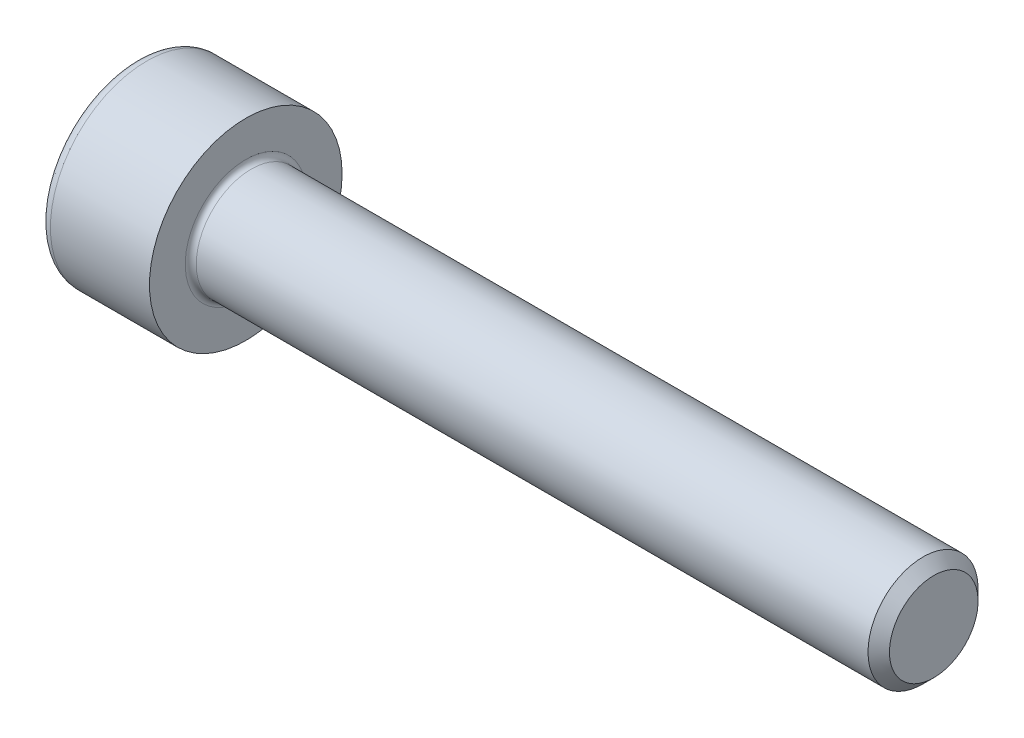
ISO-10303-21;
HEADER;
FILE_DESCRIPTION(('STEP AP214'),'2;1');
FILE_NAME('part.step','',(''),(''),'','','');
FILE_SCHEMA(('AUTOMOTIVE_DESIGN { 1 0 10303 214 1 1 1 1 }'));
ENDSEC;
DATA;
#1=APPLICATION_CONTEXT('core data for automotive mechanical design processes');
#2=APPLICATION_PROTOCOL_DEFINITION('international standard','automotive_design',2000,#1);
#3=PRODUCT_CONTEXT('',#1,'mechanical');
#4=PRODUCT('Part','Part','',(#3));
#5=PRODUCT_RELATED_PRODUCT_CATEGORY('part','',(#4));
#6=PRODUCT_DEFINITION_FORMATION('','',#4);
#7=PRODUCT_DEFINITION_CONTEXT('part definition',#1,'design');
#8=PRODUCT_DEFINITION('design','',#6,#7);
#9=PRODUCT_DEFINITION_SHAPE('','',#8);
#10=(LENGTH_UNIT() NAMED_UNIT(*) SI_UNIT(.MILLI.,.METRE.));
#11=(NAMED_UNIT(*) PLANE_ANGLE_UNIT() SI_UNIT($,.RADIAN.));
#12=(NAMED_UNIT(*) SI_UNIT($,.STERADIAN.) SOLID_ANGLE_UNIT());
#13=UNCERTAINTY_MEASURE_WITH_UNIT(LENGTH_MEASURE(1.E-05),#10,'distance_accuracy_value','');
#14=(GEOMETRIC_REPRESENTATION_CONTEXT(3) GLOBAL_UNCERTAINTY_ASSIGNED_CONTEXT((#13)) GLOBAL_UNIT_ASSIGNED_CONTEXT((#10,
#11,#12)) REPRESENTATION_CONTEXT('',''));
#15=CARTESIAN_POINT('',(0.,0.,0.));
#16=DIRECTION('',(0.,0.,1.));
#17=DIRECTION('',(1.,0.,0.));
#18=AXIS2_PLACEMENT_3D('',#15,#16,#17);
#19=CARTESIAN_POINT('',(2.,0.86602540378444,-1.5));
#20=DIRECTION('',(-1.,0.,0.));
#21=DIRECTION('',(0.,0.,1.));
#22=AXIS2_PLACEMENT_3D('',#19,#20,#21);
#23=PLANE('',#22);
#24=DIRECTION('',(0.,-1.,0.));
#25=VECTOR('',#24,1.);
#26=CARTESIAN_POINT('',(2.,0.86602540378444,1.5));
#27=LINE('',#26,#25);
#28=CARTESIAN_POINT('',(2.,0.,1.5));
#29=VERTEX_POINT('',#28);
#30=CARTESIAN_POINT('',(2.,-0.866025403784438,1.5));
#31=VERTEX_POINT('',#30);
#32=EDGE_CURVE('E167',#29,#31,#27,.T.);
#33=ORIENTED_EDGE('',*,*,#32,.F.);
#34=CARTESIAN_POINT('',(2.,0.,0.));
#35=DIRECTION('',(-1.,0.,0.));
#36=DIRECTION('',(0.,0.,1.));
#37=AXIS2_PLACEMENT_3D('',#34,#35,#36);
#38=CIRCLE('',#37,1.5);
#39=CARTESIAN_POINT('',(2.,-1.29903810567666,0.75));
#40=VERTEX_POINT('',#39);
#41=EDGE_CURVE('E50',#29,#40,#38,.F.);
#42=ORIENTED_EDGE('',*,*,#41,.T.);
#43=DIRECTION('',(0.,-0.5,-0.866025403784438));
#44=VECTOR('',#43,1.);
#45=CARTESIAN_POINT('',(2.,-0.866025403784438,1.5));
#46=LINE('',#45,#44);
#47=EDGE_CURVE('E173',#31,#40,#46,.T.);
#48=ORIENTED_EDGE('',*,*,#47,.F.);
#49=EDGE_LOOP('',(#33,#42,#48));
#50=FACE_BOUND('',#49,.T.);
#51=ADVANCED_FACE('F35',(#50),#23,.T.);
#52=CARTESIAN_POINT('',(2.,-1.73205080756888,0.));
#53=VERTEX_POINT('',#52);
#54=EDGE_CURVE('E172',#40,#53,#46,.T.);
#55=ORIENTED_EDGE('',*,*,#54,.F.);
#56=CARTESIAN_POINT('',(2.,-1.29903810567666,-0.75));
#57=VERTEX_POINT('',#56);
#58=EDGE_CURVE('E251',#40,#57,#38,.F.);
#59=ORIENTED_EDGE('',*,*,#58,.T.);
#60=DIRECTION('',(0.,0.5,-0.866025403784439));
#61=VECTOR('',#60,1.);
#62=CARTESIAN_POINT('',(2.,-1.73205080756888,0.));
#63=LINE('',#62,#61);
#64=EDGE_CURVE('E177',#53,#57,#63,.T.);
#65=ORIENTED_EDGE('',*,*,#64,.F.);
#66=EDGE_LOOP('',(#55,#59,#65));
#67=FACE_BOUND('',#66,.T.);
#68=ADVANCED_FACE('F122',(#67),#23,.T.);
#69=CARTESIAN_POINT('',(2.,-0.866025403784439,-1.5));
#70=VERTEX_POINT('',#69);
#71=EDGE_CURVE('E176',#57,#70,#63,.T.);
#72=ORIENTED_EDGE('',*,*,#71,.F.);
#73=CARTESIAN_POINT('',(2.,0.,-1.5));
#74=VERTEX_POINT('',#73);
#75=EDGE_CURVE('E247',#57,#74,#38,.F.);
#76=ORIENTED_EDGE('',*,*,#75,.T.);
#77=DIRECTION('',(0.,1.,0.));
#78=VECTOR('',#77,1.);
#79=CARTESIAN_POINT('',(2.,-0.866025403784439,-1.5));
#80=LINE('',#79,#78);
#81=EDGE_CURVE('E181',#70,#74,#80,.T.);
#82=ORIENTED_EDGE('',*,*,#81,.F.);
#83=EDGE_LOOP('',(#72,#76,#82));
#84=FACE_BOUND('',#83,.T.);
#85=ADVANCED_FACE('F129',(#84),#23,.T.);
#86=CARTESIAN_POINT('',(2.,0.86602540378444,-1.5));
#87=VERTEX_POINT('',#86);
#88=EDGE_CURVE('E180',#74,#87,#80,.T.);
#89=ORIENTED_EDGE('',*,*,#88,.F.);
#90=CARTESIAN_POINT('',(2.,1.29903810567666,-0.750000000000001));
#91=VERTEX_POINT('',#90);
#92=EDGE_CURVE('E246',#74,#91,#38,.F.);
#93=ORIENTED_EDGE('',*,*,#92,.T.);
#94=DIRECTION('',(0.,0.5,0.866025403784439));
#95=VECTOR('',#94,1.);
#96=CARTESIAN_POINT('',(2.,0.86602540378444,-1.5));
#97=LINE('',#96,#95);
#98=EDGE_CURVE('E157',#87,#91,#97,.T.);
#99=ORIENTED_EDGE('',*,*,#98,.F.);
#100=EDGE_LOOP('',(#89,#93,#99));
#101=FACE_BOUND('',#100,.T.);
#102=ADVANCED_FACE('F144',(#101),#23,.T.);
#103=CARTESIAN_POINT('',(2.,1.73205080756888,0.));
#104=VERTEX_POINT('',#103);
#105=EDGE_CURVE('E197',#91,#104,#97,.T.);
#106=ORIENTED_EDGE('',*,*,#105,.F.);
#107=CARTESIAN_POINT('',(2.,1.29903810567666,0.75));
#108=VERTEX_POINT('',#107);
#109=EDGE_CURVE('E222',#91,#108,#38,.F.);
#110=ORIENTED_EDGE('',*,*,#109,.T.);
#111=DIRECTION('',(0.,-0.5,0.866025403784439));
#112=VECTOR('',#111,1.);
#113=CARTESIAN_POINT('',(2.,1.73205080756888,0.));
#114=LINE('',#113,#112);
#115=EDGE_CURVE('E156',#104,#108,#114,.T.);
#116=ORIENTED_EDGE('',*,*,#115,.F.);
#117=EDGE_LOOP('',(#106,#110,#116));
#118=FACE_BOUND('',#117,.T.);
#119=ADVANCED_FACE('F135',(#118),#23,.T.);
#120=CARTESIAN_POINT('',(2.,0.86602540378444,1.5));
#121=VERTEX_POINT('',#120);
#122=EDGE_CURVE('E148',#108,#121,#114,.T.);
#123=ORIENTED_EDGE('',*,*,#122,.F.);
#124=EDGE_CURVE('E150',#108,#29,#38,.F.);
#125=ORIENTED_EDGE('',*,*,#124,.T.);
#126=EDGE_CURVE('E152',#121,#29,#27,.T.);
#127=ORIENTED_EDGE('',*,*,#126,.F.);
#128=EDGE_LOOP('',(#123,#125,#127));
#129=FACE_BOUND('',#128,.T.);
#130=ADVANCED_FACE('F125',(#129),#23,.T.);
#131=CARTESIAN_POINT('',(0.,0.,0.));
#132=DIRECTION('',(1.,0.,0.));
#133=DIRECTION('',(0.,0.,-1.));
#134=AXIS2_PLACEMENT_3D('',#131,#132,#133);
#135=PLANE('',#134);
#136=CARTESIAN_POINT('',(0.,0.,0.));
#137=DIRECTION('',(1.,0.,0.));
#138=DIRECTION('',(0.,0.,-1.));
#139=AXIS2_PLACEMENT_3D('',#136,#137,#138);
#140=CIRCLE('',#139,3.1);
#141=CARTESIAN_POINT('',(0.,0.,-3.1));
#142=VERTEX_POINT('',#141);
#143=EDGE_CURVE('E11',#142,#142,#140,.F.);
#144=ORIENTED_EDGE('',*,*,#143,.T.);
#145=EDGE_LOOP('',(#144));
#146=FACE_BOUND('',#145,.T.);
#147=DIRECTION('',(0.,0.5,0.866025403784439));
#148=VECTOR('',#147,1.);
#149=CARTESIAN_POINT('',(0.,0.86602540378444,-1.5));
#150=LINE('',#149,#148);
#151=CARTESIAN_POINT('',(0.,0.86602540378444,-1.5));
#152=VERTEX_POINT('',#151);
#153=CARTESIAN_POINT('',(0.,1.73205080756888,0.));
#154=VERTEX_POINT('',#153);
#155=EDGE_CURVE('E185',#152,#154,#150,.T.);
#156=ORIENTED_EDGE('',*,*,#155,.T.);
#157=DIRECTION('',(0.,-0.5,0.866025403784439));
#158=VECTOR('',#157,1.);
#159=CARTESIAN_POINT('',(0.,1.73205080756888,0.));
#160=LINE('',#159,#158);
#161=CARTESIAN_POINT('',(0.,0.86602540378444,1.5));
#162=VERTEX_POINT('',#161);
#163=EDGE_CURVE('E187',#154,#162,#160,.T.);
#164=ORIENTED_EDGE('',*,*,#163,.T.);
#165=DIRECTION('',(0.,-1.,0.));
#166=VECTOR('',#165,1.);
#167=CARTESIAN_POINT('',(0.,0.86602540378444,1.5));
#168=LINE('',#167,#166);
#169=CARTESIAN_POINT('',(0.,-0.866025403784438,1.5));
#170=VERTEX_POINT('',#169);
#171=EDGE_CURVE('E190',#162,#170,#168,.T.);
#172=ORIENTED_EDGE('',*,*,#171,.T.);
#173=DIRECTION('',(0.,-0.5,-0.866025403784438));
#174=VECTOR('',#173,1.);
#175=CARTESIAN_POINT('',(0.,-0.866025403784438,1.5));
#176=LINE('',#175,#174);
#177=CARTESIAN_POINT('',(0.,-1.73205080756888,0.));
#178=VERTEX_POINT('',#177);
#179=EDGE_CURVE('E192',#170,#178,#176,.T.);
#180=ORIENTED_EDGE('',*,*,#179,.T.);
#181=DIRECTION('',(0.,0.5,-0.866025403784439));
#182=VECTOR('',#181,1.);
#183=CARTESIAN_POINT('',(0.,-1.73205080756888,0.));
#184=LINE('',#183,#182);
#185=CARTESIAN_POINT('',(0.,-0.866025403784439,-1.5));
#186=VERTEX_POINT('',#185);
#187=EDGE_CURVE('E194',#178,#186,#184,.T.);
#188=ORIENTED_EDGE('',*,*,#187,.T.);
#189=DIRECTION('',(0.,1.,0.));
#190=VECTOR('',#189,1.);
#191=CARTESIAN_POINT('',(0.,-0.866025403784439,-1.5));
#192=LINE('',#191,#190);
#193=EDGE_CURVE('E58',#186,#152,#192,.T.);
#194=ORIENTED_EDGE('',*,*,#193,.T.);
#195=EDGE_LOOP('',(#156,#164,#172,#180,#188,#194));
#196=FACE_BOUND('',#195,.T.);
#197=ADVANCED_FACE('F134',(#146,#196),#135,.F.);
#198=CARTESIAN_POINT('',(4.,0.,0.));
#199=DIRECTION('',(1.,0.,0.));
#200=DIRECTION('',(0.,0.,-1.));
#201=AXIS2_PLACEMENT_3D('',#198,#199,#200);
#202=PLANE('',#201);
#203=CARTESIAN_POINT('',(4.,0.,0.));
#204=DIRECTION('',(1.,0.,0.));
#205=DIRECTION('',(0.,0.,-1.));
#206=AXIS2_PLACEMENT_3D('',#203,#204,#205);
#207=CIRCLE('',#206,2.2);
#208=CARTESIAN_POINT('',(4.,0.,-2.2));
#209=VERTEX_POINT('',#208);
#210=EDGE_CURVE('E223',#209,#209,#207,.F.);
#211=ORIENTED_EDGE('',*,*,#210,.T.);
#212=EDGE_LOOP('',(#211));
#213=FACE_BOUND('',#212,.T.);
#214=CARTESIAN_POINT('',(4.,0.,0.));
#215=DIRECTION('',(1.,0.,0.));
#216=DIRECTION('',(0.,0.,-1.));
#217=AXIS2_PLACEMENT_3D('',#214,#215,#216);
#218=CIRCLE('',#217,3.5);
#219=CARTESIAN_POINT('',(4.,0.,-3.5));
#220=VERTEX_POINT('',#219);
#221=EDGE_CURVE('E218',#220,#220,#218,.T.);
#222=ORIENTED_EDGE('',*,*,#221,.T.);
#223=EDGE_LOOP('',(#222));
#224=FACE_BOUND('',#223,.T.);
#225=ADVANCED_FACE('F141',(#213,#224),#202,.T.);
#226=CARTESIAN_POINT('',(4.,0.,0.));
#227=DIRECTION('',(-1.,0.,0.));
#228=DIRECTION('',(0.,0.,1.));
#229=AXIS2_PLACEMENT_3D('',#226,#227,#228);
#230=CYLINDRICAL_SURFACE('',#229,3.5);
#231=CARTESIAN_POINT('',(0.4,0.,0.));
#232=DIRECTION('',(1.,0.,0.));
#233=DIRECTION('',(0.,0.,-1.));
#234=AXIS2_PLACEMENT_3D('',#231,#232,#233);
#235=CIRCLE('',#234,3.5);
#236=CARTESIAN_POINT('',(0.4,0.,-3.5));
#237=VERTEX_POINT('',#236);
#238=EDGE_CURVE('E43',#237,#237,#235,.T.);
#239=ORIENTED_EDGE('',*,*,#238,.T.);
#240=EDGE_LOOP('',(#239));
#241=FACE_BOUND('',#240,.T.);
#242=ORIENTED_EDGE('',*,*,#221,.F.);
#243=EDGE_LOOP('',(#242));
#244=FACE_BOUND('',#243,.T.);
#245=ADVANCED_FACE('F231',(#241,#244),#230,.T.);
#246=CARTESIAN_POINT('',(29.,0.,0.));
#247=DIRECTION('',(-1.,0.,0.));
#248=DIRECTION('',(0.,0.,1.));
#249=AXIS2_PLACEMENT_3D('',#246,#247,#248);
#250=PLANE('',#249);
#251=CARTESIAN_POINT('',(29.,0.,0.));
#252=DIRECTION('',(-1.,0.,0.));
#253=DIRECTION('',(0.,0.,1.));
#254=AXIS2_PLACEMENT_3D('',#251,#252,#253);
#255=CIRCLE('',#254,1.61);
#256=CARTESIAN_POINT('',(29.,0.,1.61));
#257=VERTEX_POINT('',#256);
#258=EDGE_CURVE('E215',#257,#257,#255,.T.);
#259=ORIENTED_EDGE('',*,*,#258,.F.);
#260=EDGE_LOOP('',(#259));
#261=FACE_BOUND('',#260,.T.);
#262=ADVANCED_FACE('F388',(#261),#250,.F.);
#263=CARTESIAN_POINT('',(29.,0.,0.));
#264=DIRECTION('',(-1.,0.,0.));
#265=DIRECTION('',(0.,0.,1.));
#266=AXIS2_PLACEMENT_3D('',#263,#264,#265);
#267=CONICAL_SURFACE('',#266,1.61,0.78539816339745);
#268=CARTESIAN_POINT('',(28.61,0.,0.));
#269=DIRECTION('',(-1.,0.,0.));
#270=DIRECTION('',(0.,0.,1.));
#271=AXIS2_PLACEMENT_3D('',#268,#269,#270);
#272=CIRCLE('',#271,2.);
#273=CARTESIAN_POINT('',(28.61,0.,2.));
#274=VERTEX_POINT('',#273);
#275=EDGE_CURVE('E212',#274,#274,#272,.T.);
#276=ORIENTED_EDGE('',*,*,#275,.F.);
#277=EDGE_LOOP('',(#276));
#278=FACE_BOUND('',#277,.T.);
#279=ORIENTED_EDGE('',*,*,#258,.T.);
#280=EDGE_LOOP('',(#279));
#281=FACE_BOUND('',#280,.T.);
#282=ADVANCED_FACE('F368',(#278,#281),#267,.T.);
#283=CARTESIAN_POINT('',(0.,0.,0.));
#284=DIRECTION('',(-1.,0.,0.));
#285=DIRECTION('',(0.,0.,1.));
#286=AXIS2_PLACEMENT_3D('',#283,#284,#285);
#287=CYLINDRICAL_SURFACE('',#286,2.);
#288=CARTESIAN_POINT('',(4.2,0.,0.));
#289=DIRECTION('',(1.,0.,0.));
#290=DIRECTION('',(0.,0.,-1.));
#291=AXIS2_PLACEMENT_3D('',#288,#289,#290);
#292=CIRCLE('',#291,2.);
#293=CARTESIAN_POINT('',(4.2,0.,-2.));
#294=VERTEX_POINT('',#293);
#295=EDGE_CURVE('E226',#294,#294,#292,.T.);
#296=ORIENTED_EDGE('',*,*,#295,.T.);
#297=EDGE_LOOP('',(#296));
#298=FACE_BOUND('',#297,.T.);
#299=ORIENTED_EDGE('',*,*,#275,.T.);
#300=EDGE_LOOP('',(#299));
#301=FACE_BOUND('',#300,.T.);
#302=ADVANCED_FACE('F295',(#298,#301),#287,.T.);
#303=CARTESIAN_POINT('',(2.,0.86602540378444,-1.5));
#304=DIRECTION('',(0.,-0.866025403784439,0.5));
#305=DIRECTION('',(0.,-0.5,-0.866025403784439));
#306=AXIS2_PLACEMENT_3D('',#303,#304,#305);
#307=PLANE('',#306);
#308=ORIENTED_EDGE('',*,*,#98,.T.);
#309=ORIENTED_EDGE('',*,*,#105,.T.);
#310=DIRECTION('',(-1.,0.,0.));
#311=VECTOR('',#310,1.);
#312=CARTESIAN_POINT('',(2.,1.73205080756888,0.));
#313=LINE('',#312,#311);
#314=EDGE_CURVE('E164',#104,#154,#313,.T.);
#315=ORIENTED_EDGE('',*,*,#314,.T.);
#316=ORIENTED_EDGE('',*,*,#155,.F.);
#317=DIRECTION('',(-1.,0.,0.));
#318=VECTOR('',#317,1.);
#319=CARTESIAN_POINT('',(2.,0.86602540378444,-1.5));
#320=LINE('',#319,#318);
#321=EDGE_CURVE('E184',#87,#152,#320,.T.);
#322=ORIENTED_EDGE('',*,*,#321,.F.);
#323=EDGE_LOOP('',(#308,#309,#315,#316,#322));
#324=FACE_BOUND('',#323,.T.);
#325=ADVANCED_FACE('F243',(#324),#307,.T.);
#326=CARTESIAN_POINT('',(2.,1.73205080756888,0.));
#327=DIRECTION('',(0.,-0.866025403784439,-0.5));
#328=DIRECTION('',(0.,0.5,-0.866025403784439));
#329=AXIS2_PLACEMENT_3D('',#326,#327,#328);
#330=PLANE('',#329);
#331=ORIENTED_EDGE('',*,*,#115,.T.);
#332=ORIENTED_EDGE('',*,*,#122,.T.);
#333=DIRECTION('',(-1.,0.,0.));
#334=VECTOR('',#333,1.);
#335=CARTESIAN_POINT('',(2.,0.86602540378444,1.5));
#336=LINE('',#335,#334);
#337=EDGE_CURVE('E209',#121,#162,#336,.T.);
#338=ORIENTED_EDGE('',*,*,#337,.T.);
#339=ORIENTED_EDGE('',*,*,#163,.F.);
#340=ORIENTED_EDGE('',*,*,#314,.F.);
#341=EDGE_LOOP('',(#331,#332,#338,#339,#340));
#342=FACE_BOUND('',#341,.T.);
#343=ADVANCED_FACE('F161',(#342),#330,.T.);
#344=CARTESIAN_POINT('',(2.,0.86602540378444,1.5));
#345=DIRECTION('',(0.,0.,-1.));
#346=DIRECTION('',(-1.,0.,0.));
#347=AXIS2_PLACEMENT_3D('',#344,#345,#346);
#348=PLANE('',#347);
#349=ORIENTED_EDGE('',*,*,#126,.T.);
#350=ORIENTED_EDGE('',*,*,#32,.T.);
#351=DIRECTION('',(-1.,0.,0.));
#352=VECTOR('',#351,1.);
#353=CARTESIAN_POINT('',(2.,-0.866025403784438,1.5));
#354=LINE('',#353,#352);
#355=EDGE_CURVE('E206',#31,#170,#354,.T.);
#356=ORIENTED_EDGE('',*,*,#355,.T.);
#357=ORIENTED_EDGE('',*,*,#171,.F.);
#358=ORIENTED_EDGE('',*,*,#337,.F.);
#359=EDGE_LOOP('',(#349,#350,#356,#357,#358));
#360=FACE_BOUND('',#359,.T.);
#361=ADVANCED_FACE('F265',(#360),#348,.T.);
#362=CARTESIAN_POINT('',(2.,-0.866025403784438,1.5));
#363=DIRECTION('',(0.,0.866025403784439,-0.5));
#364=DIRECTION('',(0.,0.5,0.866025403784439));
#365=AXIS2_PLACEMENT_3D('',#362,#363,#364);
#366=PLANE('',#365);
#367=ORIENTED_EDGE('',*,*,#47,.T.);
#368=ORIENTED_EDGE('',*,*,#54,.T.);
#369=DIRECTION('',(-1.,0.,0.));
#370=VECTOR('',#369,1.);
#371=CARTESIAN_POINT('',(2.,-1.73205080756888,0.));
#372=LINE('',#371,#370);
#373=EDGE_CURVE('E203',#53,#178,#372,.T.);
#374=ORIENTED_EDGE('',*,*,#373,.T.);
#375=ORIENTED_EDGE('',*,*,#179,.F.);
#376=ORIENTED_EDGE('',*,*,#355,.F.);
#377=EDGE_LOOP('',(#367,#368,#374,#375,#376));
#378=FACE_BOUND('',#377,.T.);
#379=ADVANCED_FACE('F262',(#378),#366,.T.);
#380=CARTESIAN_POINT('',(2.,-1.73205080756888,0.));
#381=DIRECTION('',(0.,0.866025403784439,0.5));
#382=DIRECTION('',(0.,-0.5,0.866025403784439));
#383=AXIS2_PLACEMENT_3D('',#380,#381,#382);
#384=PLANE('',#383);
#385=ORIENTED_EDGE('',*,*,#64,.T.);
#386=ORIENTED_EDGE('',*,*,#71,.T.);
#387=DIRECTION('',(-1.,0.,0.));
#388=VECTOR('',#387,1.);
#389=CARTESIAN_POINT('',(2.,-0.866025403784439,-1.5));
#390=LINE('',#389,#388);
#391=EDGE_CURVE('E200',#70,#186,#390,.T.);
#392=ORIENTED_EDGE('',*,*,#391,.T.);
#393=ORIENTED_EDGE('',*,*,#187,.F.);
#394=ORIENTED_EDGE('',*,*,#373,.F.);
#395=EDGE_LOOP('',(#385,#386,#392,#393,#394));
#396=FACE_BOUND('',#395,.T.);
#397=ADVANCED_FACE('F268',(#396),#384,.T.);
#398=CARTESIAN_POINT('',(2.,-0.866025403784439,-1.5));
#399=DIRECTION('',(0.,0.,1.));
#400=DIRECTION('',(0.,-1.,0.));
#401=AXIS2_PLACEMENT_3D('',#398,#399,#400);
#402=PLANE('',#401);
#403=ORIENTED_EDGE('',*,*,#81,.T.);
#404=ORIENTED_EDGE('',*,*,#88,.T.);
#405=ORIENTED_EDGE('',*,*,#321,.T.);
#406=ORIENTED_EDGE('',*,*,#193,.F.);
#407=ORIENTED_EDGE('',*,*,#391,.F.);
#408=EDGE_LOOP('',(#403,#404,#405,#406,#407));
#409=FACE_BOUND('',#408,.T.);
#410=ADVANCED_FACE('F118',(#409),#402,.T.);
#411=CARTESIAN_POINT('',(0.,0.,0.));
#412=DIRECTION('',(-1.,0.,0.));
#413=DIRECTION('',(0.,0.,1.));
#414=AXIS2_PLACEMENT_3D('',#411,#412,#413);
#415=CYLINDRICAL_SURFACE('',#414,1.5);
#416=ORIENTED_EDGE('',*,*,#124,.F.);
#417=ORIENTED_EDGE('',*,*,#109,.F.);
#418=ORIENTED_EDGE('',*,*,#92,.F.);
#419=ORIENTED_EDGE('',*,*,#75,.F.);
#420=ORIENTED_EDGE('',*,*,#58,.F.);
#421=ORIENTED_EDGE('',*,*,#41,.F.);
#422=EDGE_LOOP('',(#416,#417,#418,#419,#420,#421));
#423=FACE_BOUND('',#422,.T.);
#424=CARTESIAN_POINT('',(2.6,0.,0.));
#425=DIRECTION('',(-1.,0.,0.));
#426=DIRECTION('',(0.,0.,1.));
#427=AXIS2_PLACEMENT_3D('',#424,#425,#426);
#428=CIRCLE('',#427,1.5);
#429=CARTESIAN_POINT('',(2.6,0.,1.5));
#430=VERTEX_POINT('',#429);
#431=EDGE_CURVE('E188',#430,#430,#428,.T.);
#432=ORIENTED_EDGE('',*,*,#431,.F.);
#433=EDGE_LOOP('',(#432));
#434=FACE_BOUND('',#433,.T.);
#435=ADVANCED_FACE('F110',(#423,#434),#415,.F.);
#436=CARTESIAN_POINT('',(3.46602540378445,0.,0.));
#437=DIRECTION('',(-1.,0.,0.));
#438=DIRECTION('',(0.,0.,1.));
#439=AXIS2_PLACEMENT_3D('',#436,#437,#438);
#440=CONICAL_SURFACE('',#439,0.,1.04719755119659);
#441=ORIENTED_EDGE('',*,*,#431,.T.);
#442=EDGE_LOOP('',(#441));
#443=FACE_BOUND('',#442,.T.);
#444=CARTESIAN_POINT('',(3.46602540378445,0.,0.));
#445=VERTEX_POINT('',#444);
#446=VERTEX_LOOP('',#445);
#447=FACE_BOUND('',#446,.T.);
#448=ADVANCED_FACE('F107',(#443,#447),#440,.F.);
#449=CARTESIAN_POINT('',(4.2,0.,0.));
#450=DIRECTION('',(1.,0.,0.));
#451=DIRECTION('',(0.,0.,-1.));
#452=AXIS2_PLACEMENT_3D('',#449,#450,#451);
#453=TOROIDAL_SURFACE('',#452,2.2,0.2);
#454=ORIENTED_EDGE('',*,*,#295,.F.);
#455=EDGE_LOOP('',(#454));
#456=FACE_BOUND('',#455,.T.);
#457=ORIENTED_EDGE('',*,*,#210,.F.);
#458=EDGE_LOOP('',(#457));
#459=FACE_BOUND('',#458,.T.);
#460=ADVANCED_FACE('F109',(#456,#459),#453,.F.);
#461=CARTESIAN_POINT('',(0.4,0.,0.));
#462=DIRECTION('',(1.,0.,0.));
#463=DIRECTION('',(0.,0.,-1.));
#464=AXIS2_PLACEMENT_3D('',#461,#462,#463);
#465=TOROIDAL_SURFACE('',#464,3.1,0.4);
#466=ORIENTED_EDGE('',*,*,#143,.F.);
#467=EDGE_LOOP('',(#466));
#468=FACE_BOUND('',#467,.T.);
#469=ORIENTED_EDGE('',*,*,#238,.F.);
#470=EDGE_LOOP('',(#469));
#471=FACE_BOUND('',#470,.T.);
#472=ADVANCED_FACE('F37',(#468,#471),#465,.T.);
#473=CLOSED_SHELL('',(#51,#68,#85,#102,#119,#130,#197,#225,#245,#262,#282,#302,#325,#343,#361,
#379,#397,#410,#435,#448,#460,#472));
#474=MANIFOLD_SOLID_BREP('B2',#473);
#475=ADVANCED_BREP_SHAPE_REPRESENTATION('',(#18,#474),#14);
#476=SHAPE_DEFINITION_REPRESENTATION(#9,#475);
ENDSEC;
END-ISO-10303-21;
